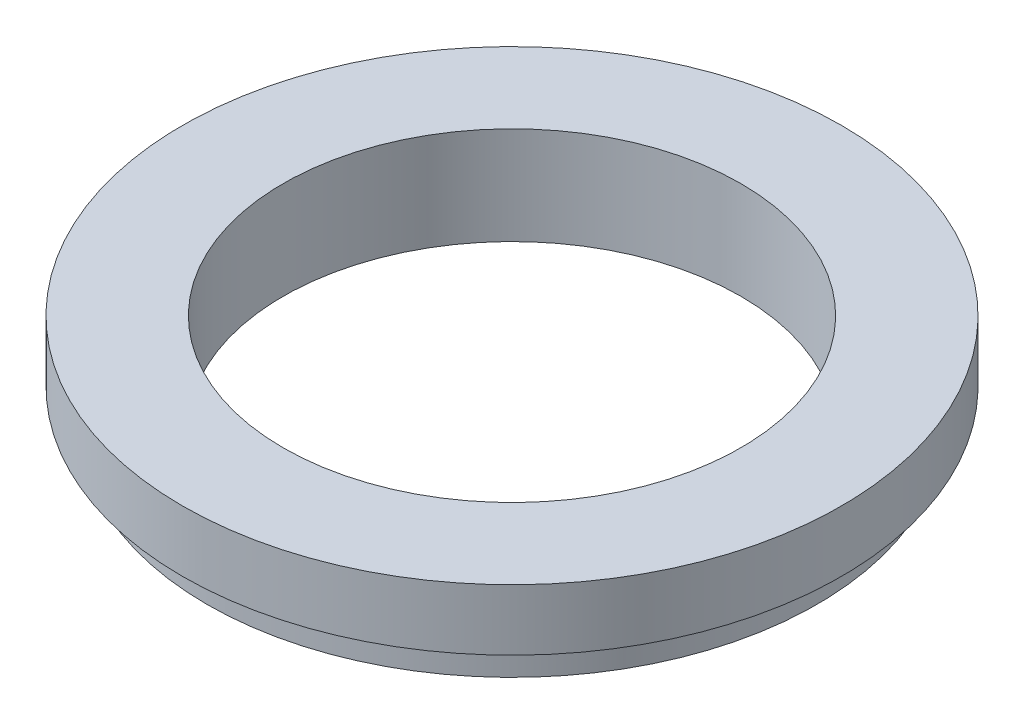
ISO-10303-21;
HEADER;
FILE_DESCRIPTION(('STEP AP214'),'2;1');
FILE_NAME('part.step','',(''),(''),'','','');
FILE_SCHEMA(('AUTOMOTIVE_DESIGN { 1 0 10303 214 1 1 1 1 }'));
ENDSEC;
DATA;
#1=APPLICATION_CONTEXT('core data for automotive mechanical design processes');
#2=APPLICATION_PROTOCOL_DEFINITION('international standard','automotive_design',2000,#1);
#3=PRODUCT_CONTEXT('',#1,'mechanical');
#4=PRODUCT('Part','Part','',(#3));
#5=PRODUCT_RELATED_PRODUCT_CATEGORY('part','',(#4));
#6=PRODUCT_DEFINITION_FORMATION('','',#4);
#7=PRODUCT_DEFINITION_CONTEXT('part definition',#1,'design');
#8=PRODUCT_DEFINITION('design','',#6,#7);
#9=PRODUCT_DEFINITION_SHAPE('','',#8);
#10=(LENGTH_UNIT() NAMED_UNIT(*) SI_UNIT(.MILLI.,.METRE.));
#11=(NAMED_UNIT(*) PLANE_ANGLE_UNIT() SI_UNIT($,.RADIAN.));
#12=(NAMED_UNIT(*) SI_UNIT($,.STERADIAN.) SOLID_ANGLE_UNIT());
#13=UNCERTAINTY_MEASURE_WITH_UNIT(LENGTH_MEASURE(1.E-05),#10,'distance_accuracy_value','');
#14=(GEOMETRIC_REPRESENTATION_CONTEXT(3) GLOBAL_UNCERTAINTY_ASSIGNED_CONTEXT((#13)) GLOBAL_UNIT_ASSIGNED_CONTEXT((#10,
#11,#12)) REPRESENTATION_CONTEXT('',''));
#15=CARTESIAN_POINT('',(0.,0.,0.));
#16=DIRECTION('',(0.,0.,1.));
#17=DIRECTION('',(1.,0.,0.));
#18=AXIS2_PLACEMENT_3D('',#15,#16,#17);
#19=CARTESIAN_POINT('',(4.7625,0.,0.));
#20=DIRECTION('',(0.,-1.,0.));
#21=DIRECTION('',(0.,0.,-1.));
#22=AXIS2_PLACEMENT_3D('',#19,#20,#21);
#23=PLANE('',#22);
#24=CARTESIAN_POINT('',(0.,0.,0.));
#25=DIRECTION('',(0.,-1.,0.));
#26=DIRECTION('',(0.,0.,-1.));
#27=AXIS2_PLACEMENT_3D('',#24,#25,#26);
#28=CIRCLE('',#27,6.34619);
#29=CARTESIAN_POINT('',(0.,0.,-6.34619));
#30=VERTEX_POINT('',#29);
#31=EDGE_CURVE('E10',#30,#30,#28,.T.);
#32=ORIENTED_EDGE('',*,*,#31,.T.);
#33=EDGE_LOOP('',(#32));
#34=FACE_BOUND('',#33,.T.);
#35=CARTESIAN_POINT('',(0.,0.,0.));
#36=DIRECTION('',(0.,-1.,0.));
#37=DIRECTION('',(0.,0.,-1.));
#38=AXIS2_PLACEMENT_3D('',#35,#36,#37);
#39=CIRCLE('',#38,4.7625);
#40=CARTESIAN_POINT('',(0.,0.,-4.7625));
#41=VERTEX_POINT('',#40);
#42=EDGE_CURVE('E52',#41,#41,#39,.T.);
#43=ORIENTED_EDGE('',*,*,#42,.F.);
#44=EDGE_LOOP('',(#43));
#45=FACE_BOUND('',#44,.T.);
#46=ADVANCED_FACE('F30',(#34,#45),#23,.T.);
#47=CARTESIAN_POINT('',(0.,2.032,0.));
#48=DIRECTION('',(0.,-1.,0.));
#49=DIRECTION('',(0.,0.,-1.));
#50=AXIS2_PLACEMENT_3D('',#47,#48,#49);
#51=CYLINDRICAL_SURFACE('',#50,6.34619);
#52=CARTESIAN_POINT('',(0.,0.762,0.));
#53=DIRECTION('',(0.,-1.,0.));
#54=DIRECTION('',(0.,0.,-1.));
#55=AXIS2_PLACEMENT_3D('',#52,#53,#54);
#56=CIRCLE('',#55,6.34619);
#57=CARTESIAN_POINT('',(0.,0.762,-6.34619));
#58=VERTEX_POINT('',#57);
#59=EDGE_CURVE('E36',#58,#58,#56,.T.);
#60=ORIENTED_EDGE('',*,*,#59,.T.);
#61=EDGE_LOOP('',(#60));
#62=FACE_BOUND('',#61,.T.);
#63=ORIENTED_EDGE('',*,*,#31,.F.);
#64=EDGE_LOOP('',(#63));
#65=FACE_BOUND('',#64,.T.);
#66=ADVANCED_FACE('F60',(#62,#65),#51,.T.);
#67=CARTESIAN_POINT('',(6.34619,0.762,0.));
#68=DIRECTION('',(0.,-1.,0.));
#69=DIRECTION('',(0.,0.,-1.));
#70=AXIS2_PLACEMENT_3D('',#67,#68,#69);
#71=PLANE('',#70);
#72=CARTESIAN_POINT('',(0.,0.762,0.));
#73=DIRECTION('',(0.,-1.,0.));
#74=DIRECTION('',(0.,0.,-1.));
#75=AXIS2_PLACEMENT_3D('',#72,#73,#74);
#76=CIRCLE('',#75,6.858);
#77=CARTESIAN_POINT('',(0.,0.762,-6.858));
#78=VERTEX_POINT('',#77);
#79=EDGE_CURVE('E40',#78,#78,#76,.T.);
#80=ORIENTED_EDGE('',*,*,#79,.T.);
#81=EDGE_LOOP('',(#80));
#82=FACE_BOUND('',#81,.T.);
#83=ORIENTED_EDGE('',*,*,#59,.F.);
#84=EDGE_LOOP('',(#83));
#85=FACE_BOUND('',#84,.T.);
#86=ADVANCED_FACE('F64',(#82,#85),#71,.T.);
#87=CARTESIAN_POINT('',(0.,2.032,0.));
#88=DIRECTION('',(0.,-1.,0.));
#89=DIRECTION('',(0.,0.,-1.));
#90=AXIS2_PLACEMENT_3D('',#87,#88,#89);
#91=CYLINDRICAL_SURFACE('',#90,6.858);
#92=CARTESIAN_POINT('',(0.,2.032,0.));
#93=DIRECTION('',(0.,-1.,0.));
#94=DIRECTION('',(0.,0.,-1.));
#95=AXIS2_PLACEMENT_3D('',#92,#93,#94);
#96=CIRCLE('',#95,6.858);
#97=CARTESIAN_POINT('',(0.,2.032,-6.858));
#98=VERTEX_POINT('',#97);
#99=EDGE_CURVE('E44',#98,#98,#96,.T.);
#100=ORIENTED_EDGE('',*,*,#99,.T.);
#101=EDGE_LOOP('',(#100));
#102=FACE_BOUND('',#101,.T.);
#103=ORIENTED_EDGE('',*,*,#79,.F.);
#104=EDGE_LOOP('',(#103));
#105=FACE_BOUND('',#104,.T.);
#106=ADVANCED_FACE('F68',(#102,#105),#91,.T.);
#107=CARTESIAN_POINT('',(6.858,2.032,0.));
#108=DIRECTION('',(0.,1.,0.));
#109=DIRECTION('',(0.,0.,1.));
#110=AXIS2_PLACEMENT_3D('',#107,#108,#109);
#111=PLANE('',#110);
#112=CARTESIAN_POINT('',(0.,2.032,0.));
#113=DIRECTION('',(0.,-1.,0.));
#114=DIRECTION('',(0.,0.,-1.));
#115=AXIS2_PLACEMENT_3D('',#112,#113,#114);
#116=CIRCLE('',#115,4.7625);
#117=CARTESIAN_POINT('',(0.,2.032,-4.7625));
#118=VERTEX_POINT('',#117);
#119=EDGE_CURVE('E49',#118,#118,#116,.T.);
#120=ORIENTED_EDGE('',*,*,#119,.T.);
#121=EDGE_LOOP('',(#120));
#122=FACE_BOUND('',#121,.T.);
#123=ORIENTED_EDGE('',*,*,#99,.F.);
#124=EDGE_LOOP('',(#123));
#125=FACE_BOUND('',#124,.T.);
#126=ADVANCED_FACE('F75',(#122,#125),#111,.T.);
#127=CARTESIAN_POINT('',(0.,2.032,0.));
#128=DIRECTION('',(0.,-1.,0.));
#129=DIRECTION('',(0.,0.,-1.));
#130=AXIS2_PLACEMENT_3D('',#127,#128,#129);
#131=CYLINDRICAL_SURFACE('',#130,4.7625);
#132=ORIENTED_EDGE('',*,*,#42,.T.);
#133=EDGE_LOOP('',(#132));
#134=FACE_BOUND('',#133,.T.);
#135=ORIENTED_EDGE('',*,*,#119,.F.);
#136=EDGE_LOOP('',(#135));
#137=FACE_BOUND('',#136,.T.);
#138=ADVANCED_FACE('F56',(#134,#137),#131,.F.);
#139=CLOSED_SHELL('',(#46,#66,#86,#106,#126,#138));
#140=MANIFOLD_SOLID_BREP('B2',#139);
#141=ADVANCED_BREP_SHAPE_REPRESENTATION('',(#18,#140),#14);
#142=SHAPE_DEFINITION_REPRESENTATION(#9,#141);
ENDSEC;
END-ISO-10303-21;
